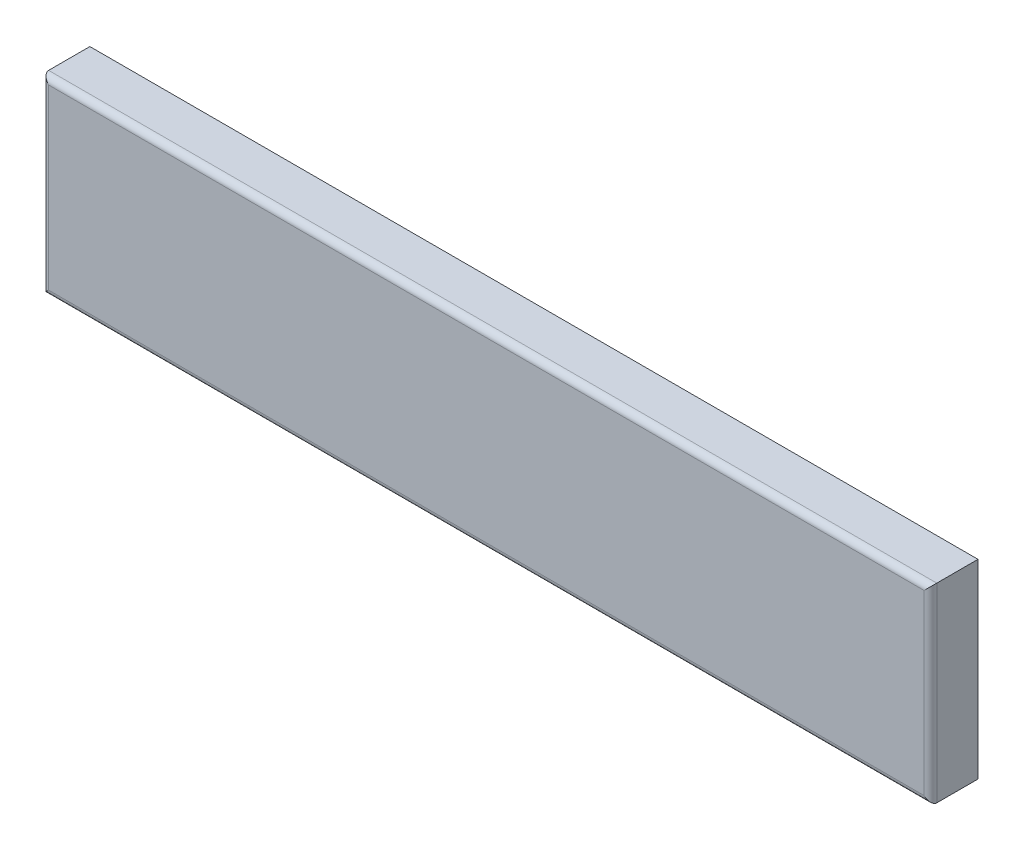
ISO-10303-21;
HEADER;
FILE_DESCRIPTION(('STEP AP214'),'2;1');
FILE_NAME('part.step','',(''),(''),'','','');
FILE_SCHEMA(('AUTOMOTIVE_DESIGN { 1 0 10303 214 1 1 1 1 }'));
ENDSEC;
DATA;
#1=APPLICATION_CONTEXT('core data for automotive mechanical design processes');
#2=APPLICATION_PROTOCOL_DEFINITION('international standard','automotive_design',2000,#1);
#3=PRODUCT_CONTEXT('',#1,'mechanical');
#4=PRODUCT('Part','Part','',(#3));
#5=PRODUCT_RELATED_PRODUCT_CATEGORY('part','',(#4));
#6=PRODUCT_DEFINITION_FORMATION('','',#4);
#7=PRODUCT_DEFINITION_CONTEXT('part definition',#1,'design');
#8=PRODUCT_DEFINITION('design','',#6,#7);
#9=PRODUCT_DEFINITION_SHAPE('','',#8);
#10=(LENGTH_UNIT() NAMED_UNIT(*) SI_UNIT(.MILLI.,.METRE.));
#11=(NAMED_UNIT(*) PLANE_ANGLE_UNIT() SI_UNIT($,.RADIAN.));
#12=(NAMED_UNIT(*) SI_UNIT($,.STERADIAN.) SOLID_ANGLE_UNIT());
#13=UNCERTAINTY_MEASURE_WITH_UNIT(LENGTH_MEASURE(1.E-05),#10,'distance_accuracy_value','');
#14=(GEOMETRIC_REPRESENTATION_CONTEXT(3) GLOBAL_UNCERTAINTY_ASSIGNED_CONTEXT((#13)) GLOBAL_UNIT_ASSIGNED_CONTEXT((#10,
#11,#12)) REPRESENTATION_CONTEXT('',''));
#15=CARTESIAN_POINT('',(0.,0.,0.));
#16=DIRECTION('',(0.,0.,1.));
#17=DIRECTION('',(1.,0.,0.));
#18=AXIS2_PLACEMENT_3D('',#15,#16,#17);
#19=CARTESIAN_POINT('',(177.8,-38.1,2.54));
#20=DIRECTION('',(-1.,0.,0.));
#21=DIRECTION('',(0.,0.,1.));
#22=AXIS2_PLACEMENT_3D('',#19,#20,#21);
#23=PLANE('',#22);
#24=DIRECTION('',(0.,0.,-1.));
#25=VECTOR('',#24,1.);
#26=CARTESIAN_POINT('',(177.8,38.1,2.54));
#27=LINE('',#26,#25);
#28=CARTESIAN_POINT('',(177.8,38.1,0.));
#29=VERTEX_POINT('',#28);
#30=CARTESIAN_POINT('',(177.8,38.1,-16.51));
#31=VERTEX_POINT('',#30);
#32=EDGE_CURVE('E167',#29,#31,#27,.T.);
#33=ORIENTED_EDGE('',*,*,#32,.F.);
#34=DIRECTION('',(0.,1.,0.));
#35=VECTOR('',#34,1.);
#36=CARTESIAN_POINT('',(177.8,-38.1,0.));
#37=LINE('',#36,#35);
#38=CARTESIAN_POINT('',(177.8,-38.1,0.));
#39=VERTEX_POINT('',#38);
#40=EDGE_CURVE('E11',#29,#39,#37,.F.);
#41=ORIENTED_EDGE('',*,*,#40,.T.);
#42=DIRECTION('',(0.,0.,-1.));
#43=VECTOR('',#42,1.);
#44=CARTESIAN_POINT('',(177.8,-38.1,2.54));
#45=LINE('',#44,#43);
#46=CARTESIAN_POINT('',(177.8,-38.1,-16.51));
#47=VERTEX_POINT('',#46);
#48=EDGE_CURVE('E161',#39,#47,#45,.T.);
#49=ORIENTED_EDGE('',*,*,#48,.T.);
#50=DIRECTION('',(0.,1.,0.));
#51=VECTOR('',#50,1.);
#52=CARTESIAN_POINT('',(177.8,-38.1,-16.51));
#53=LINE('',#52,#51);
#54=EDGE_CURVE('E152',#47,#31,#53,.T.);
#55=ORIENTED_EDGE('',*,*,#54,.T.);
#56=EDGE_LOOP('',(#33,#41,#49,#55));
#57=FACE_BOUND('',#56,.T.);
#58=ADVANCED_FACE('F33',(#57),#23,.F.);
#59=CARTESIAN_POINT('',(-177.8,38.1,2.54));
#60=DIRECTION('',(0.,-1.,0.));
#61=DIRECTION('',(0.,0.,-1.));
#62=AXIS2_PLACEMENT_3D('',#59,#60,#61);
#63=PLANE('',#62);
#64=DIRECTION('',(0.,0.,-1.));
#65=VECTOR('',#64,1.);
#66=CARTESIAN_POINT('',(-177.8,38.1,2.54));
#67=LINE('',#66,#65);
#68=CARTESIAN_POINT('',(-177.8,38.1,0.));
#69=VERTEX_POINT('',#68);
#70=CARTESIAN_POINT('',(-177.8,38.1,-16.51));
#71=VERTEX_POINT('',#70);
#72=EDGE_CURVE('E165',#69,#71,#67,.T.);
#73=ORIENTED_EDGE('',*,*,#72,.F.);
#74=DIRECTION('',(-1.,0.,0.));
#75=VECTOR('',#74,1.);
#76=CARTESIAN_POINT('',(-177.8,38.1,0.));
#77=LINE('',#76,#75);
#78=EDGE_CURVE('E42',#69,#29,#77,.F.);
#79=ORIENTED_EDGE('',*,*,#78,.T.);
#80=ORIENTED_EDGE('',*,*,#32,.T.);
#81=DIRECTION('',(-1.,0.,0.));
#82=VECTOR('',#81,1.);
#83=CARTESIAN_POINT('',(177.8,38.1,-16.51));
#84=LINE('',#83,#82);
#85=EDGE_CURVE('E155',#31,#71,#84,.T.);
#86=ORIENTED_EDGE('',*,*,#85,.T.);
#87=EDGE_LOOP('',(#73,#79,#80,#86));
#88=FACE_BOUND('',#87,.T.);
#89=ADVANCED_FACE('F222',(#88),#63,.F.);
#90=CARTESIAN_POINT('',(-177.8,-38.1,2.54));
#91=DIRECTION('',(1.,0.,0.));
#92=DIRECTION('',(0.,0.,-1.));
#93=AXIS2_PLACEMENT_3D('',#90,#91,#92);
#94=PLANE('',#93);
#95=DIRECTION('',(0.,0.,-1.));
#96=VECTOR('',#95,1.);
#97=CARTESIAN_POINT('',(-177.8,-38.1,2.54));
#98=LINE('',#97,#96);
#99=CARTESIAN_POINT('',(-177.8,-38.1,0.));
#100=VERTEX_POINT('',#99);
#101=CARTESIAN_POINT('',(-177.8,-38.1,-16.51));
#102=VERTEX_POINT('',#101);
#103=EDGE_CURVE('E163',#100,#102,#98,.T.);
#104=ORIENTED_EDGE('',*,*,#103,.F.);
#105=DIRECTION('',(0.,-1.,0.));
#106=VECTOR('',#105,1.);
#107=CARTESIAN_POINT('',(-177.8,-38.1,0.));
#108=LINE('',#107,#106);
#109=EDGE_CURVE('E57',#100,#69,#108,.F.);
#110=ORIENTED_EDGE('',*,*,#109,.T.);
#111=ORIENTED_EDGE('',*,*,#72,.T.);
#112=DIRECTION('',(0.,-1.,0.));
#113=VECTOR('',#112,1.);
#114=CARTESIAN_POINT('',(-177.8,38.1,-16.51));
#115=LINE('',#114,#113);
#116=EDGE_CURVE('E158',#71,#102,#115,.T.);
#117=ORIENTED_EDGE('',*,*,#116,.T.);
#118=EDGE_LOOP('',(#104,#110,#111,#117));
#119=FACE_BOUND('',#118,.T.);
#120=ADVANCED_FACE('F217',(#119),#94,.F.);
#121=CARTESIAN_POINT('',(-177.8,-38.1,2.54));
#122=DIRECTION('',(0.,1.,0.));
#123=DIRECTION('',(0.,0.,1.));
#124=AXIS2_PLACEMENT_3D('',#121,#122,#123);
#125=PLANE('',#124);
#126=ORIENTED_EDGE('',*,*,#48,.F.);
#127=DIRECTION('',(1.,0.,0.));
#128=VECTOR('',#127,1.);
#129=CARTESIAN_POINT('',(-177.8,-38.1,0.));
#130=LINE('',#129,#128);
#131=EDGE_CURVE('E187',#39,#100,#130,.F.);
#132=ORIENTED_EDGE('',*,*,#131,.T.);
#133=ORIENTED_EDGE('',*,*,#103,.T.);
#134=DIRECTION('',(1.,0.,0.));
#135=VECTOR('',#134,1.);
#136=CARTESIAN_POINT('',(-177.8,-38.1,-16.51));
#137=LINE('',#136,#135);
#138=EDGE_CURVE('E145',#102,#47,#137,.T.);
#139=ORIENTED_EDGE('',*,*,#138,.T.);
#140=EDGE_LOOP('',(#126,#132,#133,#139));
#141=FACE_BOUND('',#140,.T.);
#142=ADVANCED_FACE('F215',(#141),#125,.F.);
#143=CARTESIAN_POINT('',(0.,0.,2.54));
#144=DIRECTION('',(0.,0.,-1.));
#145=DIRECTION('',(-1.,0.,0.));
#146=AXIS2_PLACEMENT_3D('',#143,#144,#145);
#147=PLANE('',#146);
#148=DIRECTION('',(0.,-1.,0.));
#149=VECTOR('',#148,1.);
#150=CARTESIAN_POINT('',(-175.26,0.,2.54));
#151=LINE('',#150,#149);
#152=CARTESIAN_POINT('',(-175.26,35.56,2.54));
#153=VERTEX_POINT('',#152);
#154=CARTESIAN_POINT('',(-175.26,-35.56,2.54));
#155=VERTEX_POINT('',#154);
#156=EDGE_CURVE('E182',#153,#155,#151,.T.);
#157=ORIENTED_EDGE('',*,*,#156,.T.);
#158=DIRECTION('',(1.,0.,0.));
#159=VECTOR('',#158,1.);
#160=CARTESIAN_POINT('',(0.,-35.56,2.54));
#161=LINE('',#160,#159);
#162=CARTESIAN_POINT('',(175.26,-35.56,2.54));
#163=VERTEX_POINT('',#162);
#164=EDGE_CURVE('E184',#155,#163,#161,.T.);
#165=ORIENTED_EDGE('',*,*,#164,.T.);
#166=DIRECTION('',(0.,1.,0.));
#167=VECTOR('',#166,1.);
#168=CARTESIAN_POINT('',(175.26,0.,2.54));
#169=LINE('',#168,#167);
#170=CARTESIAN_POINT('',(175.26,35.56,2.54));
#171=VERTEX_POINT('',#170);
#172=EDGE_CURVE('E178',#163,#171,#169,.T.);
#173=ORIENTED_EDGE('',*,*,#172,.T.);
#174=DIRECTION('',(-1.,0.,0.));
#175=VECTOR('',#174,1.);
#176=CARTESIAN_POINT('',(0.,35.56,2.54));
#177=LINE('',#176,#175);
#178=EDGE_CURVE('E180',#171,#153,#177,.T.);
#179=ORIENTED_EDGE('',*,*,#178,.T.);
#180=EDGE_LOOP('',(#157,#165,#173,#179));
#181=FACE_BOUND('',#180,.T.);
#182=ADVANCED_FACE('F207',(#181),#147,.F.);
#183=CARTESIAN_POINT('',(0.,0.,-16.51));
#184=DIRECTION('',(0.,0.,1.));
#185=DIRECTION('',(1.,0.,0.));
#186=AXIS2_PLACEMENT_3D('',#183,#184,#185);
#187=PLANE('',#186);
#188=DIRECTION('',(1.,0.,0.));
#189=VECTOR('',#188,1.);
#190=CARTESIAN_POINT('',(-175.26,-35.56,-16.51));
#191=LINE('',#190,#189);
#192=CARTESIAN_POINT('',(-175.26,-35.56,-16.51));
#193=VERTEX_POINT('',#192);
#194=CARTESIAN_POINT('',(175.26,-35.56,-16.51));
#195=VERTEX_POINT('',#194);
#196=EDGE_CURVE('E123',#193,#195,#191,.T.);
#197=ORIENTED_EDGE('',*,*,#196,.T.);
#198=DIRECTION('',(0.,1.,0.));
#199=VECTOR('',#198,1.);
#200=CARTESIAN_POINT('',(175.26,-35.56,-16.51));
#201=LINE('',#200,#199);
#202=CARTESIAN_POINT('',(175.26,35.56,-16.51));
#203=VERTEX_POINT('',#202);
#204=EDGE_CURVE('E116',#195,#203,#201,.T.);
#205=ORIENTED_EDGE('',*,*,#204,.T.);
#206=DIRECTION('',(-1.,0.,0.));
#207=VECTOR('',#206,1.);
#208=CARTESIAN_POINT('',(175.26,35.56,-16.51));
#209=LINE('',#208,#207);
#210=CARTESIAN_POINT('',(-175.26,35.56,-16.51));
#211=VERTEX_POINT('',#210);
#212=EDGE_CURVE('E127',#203,#211,#209,.T.);
#213=ORIENTED_EDGE('',*,*,#212,.T.);
#214=DIRECTION('',(0.,-1.,0.));
#215=VECTOR('',#214,1.);
#216=CARTESIAN_POINT('',(-175.26,35.56,-16.51));
#217=LINE('',#216,#215);
#218=EDGE_CURVE('E132',#211,#193,#217,.T.);
#219=ORIENTED_EDGE('',*,*,#218,.T.);
#220=EDGE_LOOP('',(#197,#205,#213,#219));
#221=FACE_BOUND('',#220,.T.);
#222=ORIENTED_EDGE('',*,*,#138,.F.);
#223=ORIENTED_EDGE('',*,*,#116,.F.);
#224=ORIENTED_EDGE('',*,*,#85,.F.);
#225=ORIENTED_EDGE('',*,*,#54,.F.);
#226=EDGE_LOOP('',(#222,#223,#224,#225));
#227=FACE_BOUND('',#226,.T.);
#228=ADVANCED_FACE('F134',(#221,#227),#187,.F.);
#229=CARTESIAN_POINT('',(175.26,-35.56,-16.51));
#230=DIRECTION('',(1.,0.,0.));
#231=DIRECTION('',(0.,0.,-1.));
#232=AXIS2_PLACEMENT_3D('',#229,#230,#231);
#233=PLANE('',#232);
#234=DIRECTION('',(0.,-1.,0.));
#235=VECTOR('',#234,1.);
#236=CARTESIAN_POINT('',(175.26,0.,0.));
#237=LINE('',#236,#235);
#238=CARTESIAN_POINT('',(175.26,35.56,0.));
#239=VERTEX_POINT('',#238);
#240=CARTESIAN_POINT('',(175.26,-35.56,0.));
#241=VERTEX_POINT('',#240);
#242=EDGE_CURVE('E119',#239,#241,#237,.T.);
#243=ORIENTED_EDGE('',*,*,#242,.F.);
#244=DIRECTION('',(0.,0.,1.));
#245=VECTOR('',#244,1.);
#246=CARTESIAN_POINT('',(175.26,35.56,-16.51));
#247=LINE('',#246,#245);
#248=EDGE_CURVE('E111',#203,#239,#247,.T.);
#249=ORIENTED_EDGE('',*,*,#248,.F.);
#250=ORIENTED_EDGE('',*,*,#204,.F.);
#251=DIRECTION('',(0.,0.,1.));
#252=VECTOR('',#251,1.);
#253=CARTESIAN_POINT('',(175.26,-35.56,-16.51));
#254=LINE('',#253,#252);
#255=EDGE_CURVE('E143',#195,#241,#254,.T.);
#256=ORIENTED_EDGE('',*,*,#255,.T.);
#257=EDGE_LOOP('',(#243,#249,#250,#256));
#258=FACE_BOUND('',#257,.T.);
#259=ADVANCED_FACE('F113',(#258),#233,.F.);
#260=CARTESIAN_POINT('',(-175.26,-35.56,-16.51));
#261=DIRECTION('',(0.,-1.,0.));
#262=DIRECTION('',(0.,0.,-1.));
#263=AXIS2_PLACEMENT_3D('',#260,#261,#262);
#264=PLANE('',#263);
#265=DIRECTION('',(-1.,0.,0.));
#266=VECTOR('',#265,1.);
#267=CARTESIAN_POINT('',(0.,-35.56,0.));
#268=LINE('',#267,#266);
#269=CARTESIAN_POINT('',(-175.26,-35.56,0.));
#270=VERTEX_POINT('',#269);
#271=EDGE_CURVE('E174',#241,#270,#268,.T.);
#272=ORIENTED_EDGE('',*,*,#271,.F.);
#273=ORIENTED_EDGE('',*,*,#255,.F.);
#274=ORIENTED_EDGE('',*,*,#196,.F.);
#275=DIRECTION('',(0.,0.,1.));
#276=VECTOR('',#275,1.);
#277=CARTESIAN_POINT('',(-175.26,-35.56,-16.51));
#278=LINE('',#277,#276);
#279=EDGE_CURVE('E146',#193,#270,#278,.T.);
#280=ORIENTED_EDGE('',*,*,#279,.T.);
#281=EDGE_LOOP('',(#272,#273,#274,#280));
#282=FACE_BOUND('',#281,.T.);
#283=ADVANCED_FACE('F265',(#282),#264,.F.);
#284=CARTESIAN_POINT('',(-175.26,35.56,-16.51));
#285=DIRECTION('',(-1.,0.,0.));
#286=DIRECTION('',(0.,0.,1.));
#287=AXIS2_PLACEMENT_3D('',#284,#285,#286);
#288=PLANE('',#287);
#289=DIRECTION('',(0.,1.,0.));
#290=VECTOR('',#289,1.);
#291=CARTESIAN_POINT('',(-175.26,0.,0.));
#292=LINE('',#291,#290);
#293=CARTESIAN_POINT('',(-175.26,35.56,0.));
#294=VERTEX_POINT('',#293);
#295=EDGE_CURVE('E171',#270,#294,#292,.T.);
#296=ORIENTED_EDGE('',*,*,#295,.F.);
#297=ORIENTED_EDGE('',*,*,#279,.F.);
#298=ORIENTED_EDGE('',*,*,#218,.F.);
#299=DIRECTION('',(0.,0.,1.));
#300=VECTOR('',#299,1.);
#301=CARTESIAN_POINT('',(-175.26,35.56,-16.51));
#302=LINE('',#301,#300);
#303=EDGE_CURVE('E122',#211,#294,#302,.T.);
#304=ORIENTED_EDGE('',*,*,#303,.T.);
#305=EDGE_LOOP('',(#296,#297,#298,#304));
#306=FACE_BOUND('',#305,.T.);
#307=ADVANCED_FACE('F251',(#306),#288,.F.);
#308=CARTESIAN_POINT('',(175.26,35.56,-16.51));
#309=DIRECTION('',(0.,1.,0.));
#310=DIRECTION('',(0.,0.,1.));
#311=AXIS2_PLACEMENT_3D('',#308,#309,#310);
#312=PLANE('',#311);
#313=DIRECTION('',(1.,0.,0.));
#314=VECTOR('',#313,1.);
#315=CARTESIAN_POINT('',(0.,35.56,0.));
#316=LINE('',#315,#314);
#317=EDGE_CURVE('E169',#294,#239,#316,.T.);
#318=ORIENTED_EDGE('',*,*,#317,.F.);
#319=ORIENTED_EDGE('',*,*,#303,.F.);
#320=ORIENTED_EDGE('',*,*,#212,.F.);
#321=ORIENTED_EDGE('',*,*,#248,.T.);
#322=EDGE_LOOP('',(#318,#319,#320,#321));
#323=FACE_BOUND('',#322,.T.);
#324=ADVANCED_FACE('F128',(#323),#312,.F.);
#325=CARTESIAN_POINT('',(0.,0.,0.));
#326=DIRECTION('',(0.,0.,-1.));
#327=DIRECTION('',(-1.,0.,0.));
#328=AXIS2_PLACEMENT_3D('',#325,#326,#327);
#329=PLANE('',#328);
#330=ORIENTED_EDGE('',*,*,#317,.T.);
#331=ORIENTED_EDGE('',*,*,#242,.T.);
#332=ORIENTED_EDGE('',*,*,#271,.T.);
#333=ORIENTED_EDGE('',*,*,#295,.T.);
#334=EDGE_LOOP('',(#330,#331,#332,#333));
#335=FACE_BOUND('',#334,.T.);
#336=ADVANCED_FACE('F242',(#335),#329,.T.);
#337=CARTESIAN_POINT('',(0.,35.56,0.));
#338=DIRECTION('',(-1.,0.,0.));
#339=DIRECTION('',(0.,0.,1.));
#340=AXIS2_PLACEMENT_3D('',#337,#338,#339);
#341=CYLINDRICAL_SURFACE('',#340,2.54);
#342=CARTESIAN_POINT('',(175.26,35.56,0.));
#343=DIRECTION('',(-0.707106781186547,0.707106781186547,0.));
#344=DIRECTION('',(0.707106781186547,0.707106781186547,0.));
#345=AXIS2_PLACEMENT_3D('',#342,#343,#344);
#346=ELLIPSE('',#345,3.59210244842766,2.54);
#347=EDGE_CURVE('E139',#29,#171,#346,.F.);
#348=ORIENTED_EDGE('',*,*,#347,.F.);
#349=ORIENTED_EDGE('',*,*,#78,.F.);
#350=CARTESIAN_POINT('',(-175.26,35.56,0.));
#351=DIRECTION('',(-0.707106781186547,-0.707106781186547,0.));
#352=DIRECTION('',(-0.707106781186547,0.707106781186547,0.));
#353=AXIS2_PLACEMENT_3D('',#350,#351,#352);
#354=ELLIPSE('',#353,3.59210244842766,2.54);
#355=EDGE_CURVE('E37',#153,#69,#354,.T.);
#356=ORIENTED_EDGE('',*,*,#355,.F.);
#357=ORIENTED_EDGE('',*,*,#178,.F.);
#358=EDGE_LOOP('',(#348,#349,#356,#357));
#359=FACE_BOUND('',#358,.T.);
#360=ADVANCED_FACE('F35',(#359),#341,.T.);
#361=CARTESIAN_POINT('',(-175.26,0.,0.));
#362=DIRECTION('',(0.,-1.,0.));
#363=DIRECTION('',(0.,0.,-1.));
#364=AXIS2_PLACEMENT_3D('',#361,#362,#363);
#365=CYLINDRICAL_SURFACE('',#364,2.54);
#366=ORIENTED_EDGE('',*,*,#355,.T.);
#367=ORIENTED_EDGE('',*,*,#109,.F.);
#368=CARTESIAN_POINT('',(-175.26,-35.56,0.));
#369=DIRECTION('',(0.707106781186547,-0.707106781186547,0.));
#370=DIRECTION('',(-0.707106781186547,-0.707106781186547,0.));
#371=AXIS2_PLACEMENT_3D('',#368,#369,#370);
#372=ELLIPSE('',#371,3.59210244842766,2.54);
#373=EDGE_CURVE('E194',#155,#100,#372,.T.);
#374=ORIENTED_EDGE('',*,*,#373,.F.);
#375=ORIENTED_EDGE('',*,*,#156,.F.);
#376=EDGE_LOOP('',(#366,#367,#374,#375));
#377=FACE_BOUND('',#376,.T.);
#378=ADVANCED_FACE('F236',(#377),#365,.T.);
#379=CARTESIAN_POINT('',(175.26,0.,0.));
#380=DIRECTION('',(0.,1.,0.));
#381=DIRECTION('',(0.,0.,1.));
#382=AXIS2_PLACEMENT_3D('',#379,#380,#381);
#383=CYLINDRICAL_SURFACE('',#382,2.54);
#384=ORIENTED_EDGE('',*,*,#347,.T.);
#385=ORIENTED_EDGE('',*,*,#172,.F.);
#386=CARTESIAN_POINT('',(175.26,-35.56,0.));
#387=DIRECTION('',(0.707106781186547,0.707106781186547,0.));
#388=DIRECTION('',(-0.707106781186547,0.707106781186547,0.));
#389=AXIS2_PLACEMENT_3D('',#386,#387,#388);
#390=ELLIPSE('',#389,3.59210244842766,2.54);
#391=EDGE_CURVE('E192',#39,#163,#390,.F.);
#392=ORIENTED_EDGE('',*,*,#391,.F.);
#393=ORIENTED_EDGE('',*,*,#40,.F.);
#394=EDGE_LOOP('',(#384,#385,#392,#393));
#395=FACE_BOUND('',#394,.T.);
#396=ADVANCED_FACE('F200',(#395),#383,.T.);
#397=CARTESIAN_POINT('',(0.,-35.56,0.));
#398=DIRECTION('',(1.,0.,0.));
#399=DIRECTION('',(0.,0.,-1.));
#400=AXIS2_PLACEMENT_3D('',#397,#398,#399);
#401=CYLINDRICAL_SURFACE('',#400,2.54);
#402=ORIENTED_EDGE('',*,*,#373,.T.);
#403=ORIENTED_EDGE('',*,*,#131,.F.);
#404=ORIENTED_EDGE('',*,*,#391,.T.);
#405=ORIENTED_EDGE('',*,*,#164,.F.);
#406=EDGE_LOOP('',(#402,#403,#404,#405));
#407=FACE_BOUND('',#406,.T.);
#408=ADVANCED_FACE('F211',(#407),#401,.T.);
#409=CLOSED_SHELL('',(#58,#89,#120,#142,#182,#228,#259,#283,#307,#324,#336,#360,#378,#396,#408));
#410=MANIFOLD_SOLID_BREP('B2',#409);
#411=ADVANCED_BREP_SHAPE_REPRESENTATION('',(#18,#410),#14);
#412=SHAPE_DEFINITION_REPRESENTATION(#9,#411);
ENDSEC;
END-ISO-10303-21;
